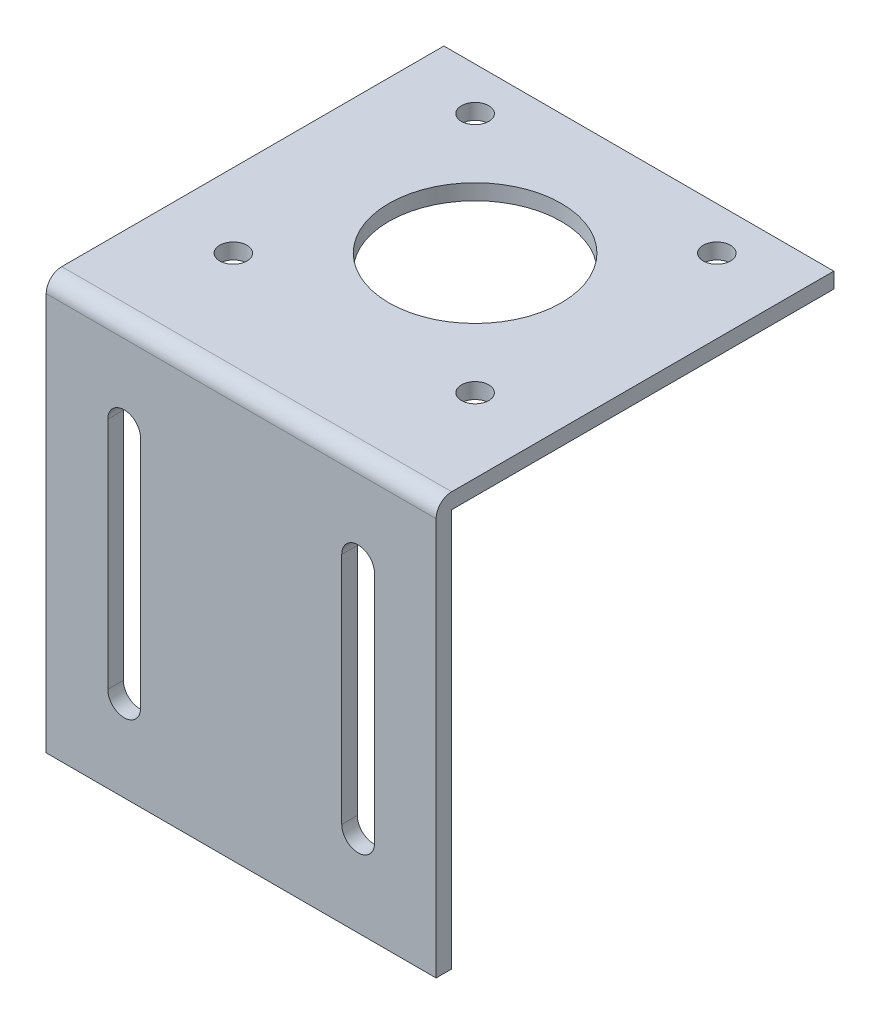
ISO-10303-21;
HEADER;
FILE_DESCRIPTION(('STEP AP214'),'2;1');
FILE_NAME('part.step','',(''),(''),'','','');
FILE_SCHEMA(('AUTOMOTIVE_DESIGN { 1 0 10303 214 1 1 1 1 }'));
ENDSEC;
DATA;
#1=APPLICATION_CONTEXT('core data for automotive mechanical design processes');
#2=APPLICATION_PROTOCOL_DEFINITION('international standard','automotive_design',2000,#1);
#3=PRODUCT_CONTEXT('',#1,'mechanical');
#4=PRODUCT('Part','Part','',(#3));
#5=PRODUCT_RELATED_PRODUCT_CATEGORY('part','',(#4));
#6=PRODUCT_DEFINITION_FORMATION('','',#4);
#7=PRODUCT_DEFINITION_CONTEXT('part definition',#1,'design');
#8=PRODUCT_DEFINITION('design','',#6,#7);
#9=PRODUCT_DEFINITION_SHAPE('','',#8);
#10=(LENGTH_UNIT() NAMED_UNIT(*) SI_UNIT(.MILLI.,.METRE.));
#11=(NAMED_UNIT(*) PLANE_ANGLE_UNIT() SI_UNIT($,.RADIAN.));
#12=(NAMED_UNIT(*) SI_UNIT($,.STERADIAN.) SOLID_ANGLE_UNIT());
#13=UNCERTAINTY_MEASURE_WITH_UNIT(LENGTH_MEASURE(1.E-05),#10,'distance_accuracy_value','');
#14=(GEOMETRIC_REPRESENTATION_CONTEXT(3) GLOBAL_UNCERTAINTY_ASSIGNED_CONTEXT((#13)) GLOBAL_UNIT_ASSIGNED_CONTEXT((#10,
#11,#12)) REPRESENTATION_CONTEXT('',''));
#15=CARTESIAN_POINT('',(0.,0.,0.));
#16=DIRECTION('',(0.,0.,1.));
#17=DIRECTION('',(1.,0.,0.));
#18=AXIS2_PLACEMENT_3D('',#15,#16,#17);
#19=CARTESIAN_POINT('',(0.,2.,0.));
#20=DIRECTION('',(0.,1.,0.));
#21=DIRECTION('',(0.,0.,1.));
#22=AXIS2_PLACEMENT_3D('',#19,#20,#21);
#23=PLANE('',#22);
#24=CARTESIAN_POINT('',(-9.5,2.,12.));
#25=DIRECTION('',(0.,1.,0.));
#26=DIRECTION('',(0.,0.,1.));
#27=AXIS2_PLACEMENT_3D('',#24,#25,#26);
#28=CIRCLE('',#27,1.75);
#29=CARTESIAN_POINT('',(-9.5,2.,13.75));
#30=VERTEX_POINT('',#29);
#31=EDGE_CURVE('E243',#30,#30,#28,.T.);
#32=ORIENTED_EDGE('',*,*,#31,.F.);
#33=EDGE_LOOP('',(#32));
#34=FACE_BOUND('',#33,.T.);
#35=CARTESIAN_POINT('',(-40.5,2.,-19.));
#36=DIRECTION('',(0.,1.,0.));
#37=DIRECTION('',(0.,0.,1.));
#38=AXIS2_PLACEMENT_3D('',#35,#36,#37);
#39=CIRCLE('',#38,1.75);
#40=CARTESIAN_POINT('',(-40.5,2.,-17.25));
#41=VERTEX_POINT('',#40);
#42=EDGE_CURVE('E255',#41,#41,#39,.T.);
#43=ORIENTED_EDGE('',*,*,#42,.F.);
#44=EDGE_LOOP('',(#43));
#45=FACE_BOUND('',#44,.T.);
#46=DIRECTION('',(0.,0.,1.));
#47=VECTOR('',#46,1.);
#48=CARTESIAN_POINT('',(-50.,2.,-24.5));
#49=LINE('',#48,#47);
#50=CARTESIAN_POINT('',(-50.,2.,-24.5));
#51=VERTEX_POINT('',#50);
#52=CARTESIAN_POINT('',(-50.,2.,24.5));
#53=VERTEX_POINT('',#52);
#54=EDGE_CURVE('E267',#51,#53,#49,.T.);
#55=ORIENTED_EDGE('',*,*,#54,.T.);
#56=DIRECTION('',(-1.,0.,0.));
#57=VECTOR('',#56,1.);
#58=CARTESIAN_POINT('',(0.,2.,24.5));
#59=LINE('',#58,#57);
#60=CARTESIAN_POINT('',(0.,2.,24.5));
#61=VERTEX_POINT('',#60);
#62=EDGE_CURVE('E44',#53,#61,#59,.F.);
#63=ORIENTED_EDGE('',*,*,#62,.T.);
#64=DIRECTION('',(0.,0.,-1.));
#65=VECTOR('',#64,1.);
#66=CARTESIAN_POINT('',(0.,2.,-24.5));
#67=LINE('',#66,#65);
#68=CARTESIAN_POINT('',(0.,2.,-24.5));
#69=VERTEX_POINT('',#68);
#70=EDGE_CURVE('E269',#61,#69,#67,.T.);
#71=ORIENTED_EDGE('',*,*,#70,.T.);
#72=DIRECTION('',(-1.,0.,0.));
#73=VECTOR('',#72,1.);
#74=CARTESIAN_POINT('',(-50.,2.,-24.5));
#75=LINE('',#74,#73);
#76=EDGE_CURVE('E272',#69,#51,#75,.T.);
#77=ORIENTED_EDGE('',*,*,#76,.T.);
#78=EDGE_LOOP('',(#55,#63,#71,#77));
#79=FACE_BOUND('',#78,.T.);
#80=CARTESIAN_POINT('',(-25.,2.,-3.5));
#81=DIRECTION('',(0.,1.,0.));
#82=DIRECTION('',(0.,0.,1.));
#83=AXIS2_PLACEMENT_3D('',#80,#81,#82);
#84=CIRCLE('',#83,11.05);
#85=CARTESIAN_POINT('',(-25.,2.,7.55));
#86=VERTEX_POINT('',#85);
#87=EDGE_CURVE('E261',#86,#86,#84,.T.);
#88=ORIENTED_EDGE('',*,*,#87,.F.);
#89=EDGE_LOOP('',(#88));
#90=FACE_BOUND('',#89,.T.);
#91=CARTESIAN_POINT('',(-9.5,2.,-19.));
#92=DIRECTION('',(0.,1.,0.));
#93=DIRECTION('',(0.,0.,1.));
#94=AXIS2_PLACEMENT_3D('',#91,#92,#93);
#95=CIRCLE('',#94,1.75);
#96=CARTESIAN_POINT('',(-9.5,2.,-17.25));
#97=VERTEX_POINT('',#96);
#98=EDGE_CURVE('E249',#97,#97,#95,.T.);
#99=ORIENTED_EDGE('',*,*,#98,.F.);
#100=EDGE_LOOP('',(#99));
#101=FACE_BOUND('',#100,.T.);
#102=CARTESIAN_POINT('',(-40.5,2.,12.));
#103=DIRECTION('',(0.,1.,0.));
#104=DIRECTION('',(0.,0.,1.));
#105=AXIS2_PLACEMENT_3D('',#102,#103,#104);
#106=CIRCLE('',#105,1.75);
#107=CARTESIAN_POINT('',(-40.5,2.,13.75));
#108=VERTEX_POINT('',#107);
#109=EDGE_CURVE('E237',#108,#108,#106,.T.);
#110=ORIENTED_EDGE('',*,*,#109,.F.);
#111=EDGE_LOOP('',(#110));
#112=FACE_BOUND('',#111,.T.);
#113=ADVANCED_FACE('F36',(#34,#45,#79,#90,#101,#112),#23,.T.);
#114=CARTESIAN_POINT('',(0.,0.,0.));
#115=DIRECTION('',(0.,1.,0.));
#116=DIRECTION('',(0.,0.,1.));
#117=AXIS2_PLACEMENT_3D('',#114,#115,#116);
#118=PLANE('',#117);
#119=DIRECTION('',(0.,0.,1.));
#120=VECTOR('',#119,1.);
#121=CARTESIAN_POINT('',(-50.,0.,-24.5));
#122=LINE('',#121,#120);
#123=CARTESIAN_POINT('',(-50.,0.,-24.5));
#124=VERTEX_POINT('',#123);
#125=CARTESIAN_POINT('',(-50.,0.,24.5));
#126=VERTEX_POINT('',#125);
#127=EDGE_CURVE('E264',#124,#126,#122,.T.);
#128=ORIENTED_EDGE('',*,*,#127,.F.);
#129=DIRECTION('',(-1.,0.,0.));
#130=VECTOR('',#129,1.);
#131=CARTESIAN_POINT('',(-50.,0.,-24.5));
#132=LINE('',#131,#130);
#133=CARTESIAN_POINT('',(0.,0.,-24.5));
#134=VERTEX_POINT('',#133);
#135=EDGE_CURVE('E270',#134,#124,#132,.T.);
#136=ORIENTED_EDGE('',*,*,#135,.F.);
#137=DIRECTION('',(0.,0.,-1.));
#138=VECTOR('',#137,1.);
#139=CARTESIAN_POINT('',(0.,0.,-24.5));
#140=LINE('',#139,#138);
#141=CARTESIAN_POINT('',(0.,0.,24.5));
#142=VERTEX_POINT('',#141);
#143=EDGE_CURVE('E280',#142,#134,#140,.T.);
#144=ORIENTED_EDGE('',*,*,#143,.F.);
#145=DIRECTION('',(1.,0.,0.));
#146=VECTOR('',#145,1.);
#147=CARTESIAN_POINT('',(-50.,0.,24.5));
#148=LINE('',#147,#146);
#149=EDGE_CURVE('E277',#126,#142,#148,.T.);
#150=ORIENTED_EDGE('',*,*,#149,.F.);
#151=EDGE_LOOP('',(#128,#136,#144,#150));
#152=FACE_BOUND('',#151,.T.);
#153=CARTESIAN_POINT('',(-25.,0.,-3.5));
#154=DIRECTION('',(0.,1.,0.));
#155=DIRECTION('',(0.,0.,1.));
#156=AXIS2_PLACEMENT_3D('',#153,#154,#155);
#157=CIRCLE('',#156,11.05);
#158=CARTESIAN_POINT('',(-25.,0.,7.55));
#159=VERTEX_POINT('',#158);
#160=EDGE_CURVE('E258',#159,#159,#157,.T.);
#161=ORIENTED_EDGE('',*,*,#160,.T.);
#162=EDGE_LOOP('',(#161));
#163=FACE_BOUND('',#162,.T.);
#164=CARTESIAN_POINT('',(-40.5,0.,-19.));
#165=DIRECTION('',(0.,1.,0.));
#166=DIRECTION('',(0.,0.,1.));
#167=AXIS2_PLACEMENT_3D('',#164,#165,#166);
#168=CIRCLE('',#167,1.75);
#169=CARTESIAN_POINT('',(-40.5,0.,-17.25));
#170=VERTEX_POINT('',#169);
#171=EDGE_CURVE('E252',#170,#170,#168,.T.);
#172=ORIENTED_EDGE('',*,*,#171,.T.);
#173=EDGE_LOOP('',(#172));
#174=FACE_BOUND('',#173,.T.);
#175=CARTESIAN_POINT('',(-9.5,0.,-19.));
#176=DIRECTION('',(0.,1.,0.));
#177=DIRECTION('',(0.,0.,1.));
#178=AXIS2_PLACEMENT_3D('',#175,#176,#177);
#179=CIRCLE('',#178,1.75);
#180=CARTESIAN_POINT('',(-9.5,0.,-17.25));
#181=VERTEX_POINT('',#180);
#182=EDGE_CURVE('E246',#181,#181,#179,.T.);
#183=ORIENTED_EDGE('',*,*,#182,.T.);
#184=EDGE_LOOP('',(#183));
#185=FACE_BOUND('',#184,.T.);
#186=CARTESIAN_POINT('',(-9.5,0.,12.));
#187=DIRECTION('',(0.,1.,0.));
#188=DIRECTION('',(0.,0.,1.));
#189=AXIS2_PLACEMENT_3D('',#186,#187,#188);
#190=CIRCLE('',#189,1.75);
#191=CARTESIAN_POINT('',(-9.5,0.,13.75));
#192=VERTEX_POINT('',#191);
#193=EDGE_CURVE('E240',#192,#192,#190,.T.);
#194=ORIENTED_EDGE('',*,*,#193,.T.);
#195=EDGE_LOOP('',(#194));
#196=FACE_BOUND('',#195,.T.);
#197=CARTESIAN_POINT('',(-40.5,0.,12.));
#198=DIRECTION('',(0.,1.,0.));
#199=DIRECTION('',(0.,0.,1.));
#200=AXIS2_PLACEMENT_3D('',#197,#198,#199);
#201=CIRCLE('',#200,1.75);
#202=CARTESIAN_POINT('',(-40.5,0.,13.75));
#203=VERTEX_POINT('',#202);
#204=EDGE_CURVE('E236',#203,#203,#201,.T.);
#205=ORIENTED_EDGE('',*,*,#204,.T.);
#206=EDGE_LOOP('',(#205));
#207=FACE_BOUND('',#206,.T.);
#208=ADVANCED_FACE('F311',(#152,#163,#174,#185,#196,#207),#118,.F.);
#209=CARTESIAN_POINT('',(-50.,2.,-24.5));
#210=DIRECTION('',(1.,0.,0.));
#211=DIRECTION('',(0.,0.,-1.));
#212=AXIS2_PLACEMENT_3D('',#209,#210,#211);
#213=PLANE('',#212);
#214=DIRECTION('',(0.,-1.,0.));
#215=VECTOR('',#214,1.);
#216=CARTESIAN_POINT('',(-50.,0.,26.5));
#217=LINE('',#216,#215);
#218=CARTESIAN_POINT('',(-50.,0.,26.5));
#219=VERTEX_POINT('',#218);
#220=CARTESIAN_POINT('',(-50.,-51.,26.5));
#221=VERTEX_POINT('',#220);
#222=EDGE_CURVE('E219',#219,#221,#217,.T.);
#223=ORIENTED_EDGE('',*,*,#222,.F.);
#224=CARTESIAN_POINT('',(-50.,0.,24.5));
#225=DIRECTION('',(1.,0.,0.));
#226=DIRECTION('',(0.,0.,-1.));
#227=AXIS2_PLACEMENT_3D('',#224,#225,#226);
#228=CIRCLE('',#227,2.);
#229=EDGE_CURVE('E58',#219,#53,#228,.F.);
#230=ORIENTED_EDGE('',*,*,#229,.T.);
#231=ORIENTED_EDGE('',*,*,#54,.F.);
#232=DIRECTION('',(0.,-1.,0.));
#233=VECTOR('',#232,1.);
#234=CARTESIAN_POINT('',(-50.,2.,-24.5));
#235=LINE('',#234,#233);
#236=EDGE_CURVE('E274',#51,#124,#235,.T.);
#237=ORIENTED_EDGE('',*,*,#236,.T.);
#238=ORIENTED_EDGE('',*,*,#127,.T.);
#239=DIRECTION('',(0.,-1.,0.));
#240=VECTOR('',#239,1.);
#241=CARTESIAN_POINT('',(-50.,0.,24.5));
#242=LINE('',#241,#240);
#243=CARTESIAN_POINT('',(-50.,-51.,24.5));
#244=VERTEX_POINT('',#243);
#245=EDGE_CURVE('E215',#126,#244,#242,.T.);
#246=ORIENTED_EDGE('',*,*,#245,.T.);
#247=DIRECTION('',(0.,0.,-1.));
#248=VECTOR('',#247,1.);
#249=CARTESIAN_POINT('',(-50.,-51.,26.5));
#250=LINE('',#249,#248);
#251=EDGE_CURVE('E233',#221,#244,#250,.T.);
#252=ORIENTED_EDGE('',*,*,#251,.F.);
#253=EDGE_LOOP('',(#223,#230,#231,#237,#238,#246,#252));
#254=FACE_BOUND('',#253,.T.);
#255=ADVANCED_FACE('F297',(#254),#213,.F.);
#256=CARTESIAN_POINT('',(0.,2.,-24.5));
#257=DIRECTION('',(-1.,0.,0.));
#258=DIRECTION('',(0.,0.,1.));
#259=AXIS2_PLACEMENT_3D('',#256,#257,#258);
#260=PLANE('',#259);
#261=ORIENTED_EDGE('',*,*,#70,.F.);
#262=CARTESIAN_POINT('',(0.,0.,24.5));
#263=DIRECTION('',(-1.,0.,0.));
#264=DIRECTION('',(0.,0.,1.));
#265=AXIS2_PLACEMENT_3D('',#262,#263,#264);
#266=CIRCLE('',#265,2.);
#267=CARTESIAN_POINT('',(0.,0.,26.5));
#268=VERTEX_POINT('',#267);
#269=EDGE_CURVE('E11',#61,#268,#266,.F.);
#270=ORIENTED_EDGE('',*,*,#269,.T.);
#271=DIRECTION('',(0.,1.,0.));
#272=VECTOR('',#271,1.);
#273=CARTESIAN_POINT('',(0.,0.,26.5));
#274=LINE('',#273,#272);
#275=CARTESIAN_POINT('',(0.,-51.,26.5));
#276=VERTEX_POINT('',#275);
#277=EDGE_CURVE('E216',#276,#268,#274,.T.);
#278=ORIENTED_EDGE('',*,*,#277,.F.);
#279=DIRECTION('',(0.,0.,-1.));
#280=VECTOR('',#279,1.);
#281=CARTESIAN_POINT('',(0.,-51.,26.5));
#282=LINE('',#281,#280);
#283=CARTESIAN_POINT('',(0.,-51.,24.5));
#284=VERTEX_POINT('',#283);
#285=EDGE_CURVE('E225',#276,#284,#282,.T.);
#286=ORIENTED_EDGE('',*,*,#285,.T.);
#287=DIRECTION('',(0.,1.,0.));
#288=VECTOR('',#287,1.);
#289=CARTESIAN_POINT('',(0.,0.,24.5));
#290=LINE('',#289,#288);
#291=EDGE_CURVE('E220',#284,#142,#290,.T.);
#292=ORIENTED_EDGE('',*,*,#291,.T.);
#293=ORIENTED_EDGE('',*,*,#143,.T.);
#294=DIRECTION('',(0.,-1.,0.));
#295=VECTOR('',#294,1.);
#296=CARTESIAN_POINT('',(0.,2.,-24.5));
#297=LINE('',#296,#295);
#298=EDGE_CURVE('E285',#69,#134,#297,.T.);
#299=ORIENTED_EDGE('',*,*,#298,.F.);
#300=EDGE_LOOP('',(#261,#270,#278,#286,#292,#293,#299));
#301=FACE_BOUND('',#300,.T.);
#302=ADVANCED_FACE('F306',(#301),#260,.F.);
#303=CARTESIAN_POINT('',(-50.,2.,-24.5));
#304=DIRECTION('',(0.,0.,1.));
#305=DIRECTION('',(1.,0.,0.));
#306=AXIS2_PLACEMENT_3D('',#303,#304,#305);
#307=PLANE('',#306);
#308=ORIENTED_EDGE('',*,*,#135,.T.);
#309=ORIENTED_EDGE('',*,*,#236,.F.);
#310=ORIENTED_EDGE('',*,*,#76,.F.);
#311=ORIENTED_EDGE('',*,*,#298,.T.);
#312=EDGE_LOOP('',(#308,#309,#310,#311));
#313=FACE_BOUND('',#312,.T.);
#314=ADVANCED_FACE('F317',(#313),#307,.F.);
#315=CARTESIAN_POINT('',(-25.,2.,-3.5));
#316=DIRECTION('',(0.,-1.,0.));
#317=DIRECTION('',(0.,0.,-1.));
#318=AXIS2_PLACEMENT_3D('',#315,#316,#317);
#319=CYLINDRICAL_SURFACE('',#318,11.05);
#320=ORIENTED_EDGE('',*,*,#87,.T.);
#321=EDGE_LOOP('',(#320));
#322=FACE_BOUND('',#321,.T.);
#323=ORIENTED_EDGE('',*,*,#160,.F.);
#324=EDGE_LOOP('',(#323));
#325=FACE_BOUND('',#324,.T.);
#326=ADVANCED_FACE('F337',(#322,#325),#319,.F.);
#327=CARTESIAN_POINT('',(-40.5,2.,-19.));
#328=DIRECTION('',(0.,-1.,0.));
#329=DIRECTION('',(0.,0.,-1.));
#330=AXIS2_PLACEMENT_3D('',#327,#328,#329);
#331=CYLINDRICAL_SURFACE('',#330,1.75);
#332=ORIENTED_EDGE('',*,*,#42,.T.);
#333=EDGE_LOOP('',(#332));
#334=FACE_BOUND('',#333,.T.);
#335=ORIENTED_EDGE('',*,*,#171,.F.);
#336=EDGE_LOOP('',(#335));
#337=FACE_BOUND('',#336,.T.);
#338=ADVANCED_FACE('F363',(#334,#337),#331,.F.);
#339=CARTESIAN_POINT('',(-9.5,2.,-19.));
#340=DIRECTION('',(0.,-1.,0.));
#341=DIRECTION('',(0.,0.,-1.));
#342=AXIS2_PLACEMENT_3D('',#339,#340,#341);
#343=CYLINDRICAL_SURFACE('',#342,1.75);
#344=ORIENTED_EDGE('',*,*,#98,.T.);
#345=EDGE_LOOP('',(#344));
#346=FACE_BOUND('',#345,.T.);
#347=ORIENTED_EDGE('',*,*,#182,.F.);
#348=EDGE_LOOP('',(#347));
#349=FACE_BOUND('',#348,.T.);
#350=ADVANCED_FACE('F370',(#346,#349),#343,.F.);
#351=CARTESIAN_POINT('',(-9.5,2.,12.));
#352=DIRECTION('',(0.,-1.,0.));
#353=DIRECTION('',(0.,0.,-1.));
#354=AXIS2_PLACEMENT_3D('',#351,#352,#353);
#355=CYLINDRICAL_SURFACE('',#354,1.75);
#356=ORIENTED_EDGE('',*,*,#31,.T.);
#357=EDGE_LOOP('',(#356));
#358=FACE_BOUND('',#357,.T.);
#359=ORIENTED_EDGE('',*,*,#193,.F.);
#360=EDGE_LOOP('',(#359));
#361=FACE_BOUND('',#360,.T.);
#362=ADVANCED_FACE('F377',(#358,#361),#355,.F.);
#363=CARTESIAN_POINT('',(-40.5,2.,12.));
#364=DIRECTION('',(0.,-1.,0.));
#365=DIRECTION('',(0.,0.,-1.));
#366=AXIS2_PLACEMENT_3D('',#363,#364,#365);
#367=CYLINDRICAL_SURFACE('',#366,1.75);
#368=ORIENTED_EDGE('',*,*,#109,.T.);
#369=EDGE_LOOP('',(#368));
#370=FACE_BOUND('',#369,.T.);
#371=ORIENTED_EDGE('',*,*,#204,.F.);
#372=EDGE_LOOP('',(#371));
#373=FACE_BOUND('',#372,.T.);
#374=ADVANCED_FACE('F385',(#370,#373),#367,.F.);
#375=CARTESIAN_POINT('',(0.,0.,24.5));
#376=DIRECTION('',(0.,0.,1.));
#377=DIRECTION('',(1.,0.,0.));
#378=AXIS2_PLACEMENT_3D('',#375,#376,#377);
#379=PLANE('',#378);
#380=CARTESIAN_POINT('',(-10.,-9.99999999999999,24.5));
#381=DIRECTION('',(0.,0.,1.));
#382=DIRECTION('',(-1.,0.,0.));
#383=AXIS2_PLACEMENT_3D('',#380,#381,#382);
#384=CIRCLE('',#383,2.1);
#385=CARTESIAN_POINT('',(-7.90000000000001,-9.99999999999999,24.5));
#386=VERTEX_POINT('',#385);
#387=CARTESIAN_POINT('',(-12.1,-9.99999999999999,24.5));
#388=VERTEX_POINT('',#387);
#389=EDGE_CURVE('E161',#386,#388,#384,.T.);
#390=ORIENTED_EDGE('',*,*,#389,.T.);
#391=DIRECTION('',(0.,-1.,0.));
#392=VECTOR('',#391,1.);
#393=CARTESIAN_POINT('',(-12.1,-9.99999999999999,24.5));
#394=LINE('',#393,#392);
#395=CARTESIAN_POINT('',(-12.1,-40.,24.5));
#396=VERTEX_POINT('',#395);
#397=EDGE_CURVE('E198',#388,#396,#394,.T.);
#398=ORIENTED_EDGE('',*,*,#397,.T.);
#399=CARTESIAN_POINT('',(-10.,-40.,24.5));
#400=DIRECTION('',(0.,0.,1.));
#401=DIRECTION('',(-1.,0.,0.));
#402=AXIS2_PLACEMENT_3D('',#399,#400,#401);
#403=CIRCLE('',#402,2.1);
#404=CARTESIAN_POINT('',(-7.90000000000001,-40.,24.5));
#405=VERTEX_POINT('',#404);
#406=EDGE_CURVE('E201',#396,#405,#403,.T.);
#407=ORIENTED_EDGE('',*,*,#406,.T.);
#408=DIRECTION('',(0.,1.,0.));
#409=VECTOR('',#408,1.);
#410=CARTESIAN_POINT('',(-7.90000000000001,-9.99999999999999,24.5));
#411=LINE('',#410,#409);
#412=EDGE_CURVE('E188',#405,#386,#411,.T.);
#413=ORIENTED_EDGE('',*,*,#412,.T.);
#414=EDGE_LOOP('',(#390,#398,#407,#413));
#415=FACE_BOUND('',#414,.T.);
#416=CARTESIAN_POINT('',(-40.,-9.99999999999999,24.5));
#417=DIRECTION('',(0.,0.,1.));
#418=DIRECTION('',(-1.,0.,0.));
#419=AXIS2_PLACEMENT_3D('',#416,#417,#418);
#420=CIRCLE('',#419,2.1);
#421=CARTESIAN_POINT('',(-37.9,-9.99999999999999,24.5));
#422=VERTEX_POINT('',#421);
#423=CARTESIAN_POINT('',(-42.1,-9.99999999999999,24.5));
#424=VERTEX_POINT('',#423);
#425=EDGE_CURVE('E173',#422,#424,#420,.T.);
#426=ORIENTED_EDGE('',*,*,#425,.T.);
#427=DIRECTION('',(0.,-1.,0.));
#428=VECTOR('',#427,1.);
#429=CARTESIAN_POINT('',(-42.1,-9.99999999999999,24.5));
#430=LINE('',#429,#428);
#431=CARTESIAN_POINT('',(-42.1,-40.,24.5));
#432=VERTEX_POINT('',#431);
#433=EDGE_CURVE('E160',#424,#432,#430,.T.);
#434=ORIENTED_EDGE('',*,*,#433,.T.);
#435=CARTESIAN_POINT('',(-40.,-40.,24.5));
#436=DIRECTION('',(0.,0.,1.));
#437=DIRECTION('',(-1.,0.,0.));
#438=AXIS2_PLACEMENT_3D('',#435,#436,#437);
#439=CIRCLE('',#438,2.1);
#440=CARTESIAN_POINT('',(-37.9,-40.,24.5));
#441=VERTEX_POINT('',#440);
#442=EDGE_CURVE('E176',#432,#441,#439,.T.);
#443=ORIENTED_EDGE('',*,*,#442,.T.);
#444=DIRECTION('',(0.,1.,0.));
#445=VECTOR('',#444,1.);
#446=CARTESIAN_POINT('',(-37.9,-9.99999999999999,24.5));
#447=LINE('',#446,#445);
#448=EDGE_CURVE('E154',#441,#422,#447,.T.);
#449=ORIENTED_EDGE('',*,*,#448,.T.);
#450=EDGE_LOOP('',(#426,#434,#443,#449));
#451=FACE_BOUND('',#450,.T.);
#452=ORIENTED_EDGE('',*,*,#245,.F.);
#453=ORIENTED_EDGE('',*,*,#149,.T.);
#454=ORIENTED_EDGE('',*,*,#291,.F.);
#455=DIRECTION('',(1.,0.,0.));
#456=VECTOR('',#455,1.);
#457=CARTESIAN_POINT('',(0.,-51.,24.5));
#458=LINE('',#457,#456);
#459=EDGE_CURVE('E227',#244,#284,#458,.T.);
#460=ORIENTED_EDGE('',*,*,#459,.F.);
#461=EDGE_LOOP('',(#452,#453,#454,#460));
#462=FACE_BOUND('',#461,.T.);
#463=ADVANCED_FACE('F308',(#415,#451,#462),#379,.F.);
#464=CARTESIAN_POINT('',(0.,0.,26.5));
#465=DIRECTION('',(0.,0.,1.));
#466=DIRECTION('',(1.,0.,0.));
#467=AXIS2_PLACEMENT_3D('',#464,#465,#466);
#468=PLANE('',#467);
#469=ORIENTED_EDGE('',*,*,#277,.T.);
#470=DIRECTION('',(-1.,0.,0.));
#471=VECTOR('',#470,1.);
#472=CARTESIAN_POINT('',(0.,0.,26.5));
#473=LINE('',#472,#471);
#474=EDGE_CURVE('E288',#268,#219,#473,.T.);
#475=ORIENTED_EDGE('',*,*,#474,.T.);
#476=ORIENTED_EDGE('',*,*,#222,.T.);
#477=DIRECTION('',(1.,0.,0.));
#478=VECTOR('',#477,1.);
#479=CARTESIAN_POINT('',(0.,-51.,26.5));
#480=LINE('',#479,#478);
#481=EDGE_CURVE('E222',#221,#276,#480,.T.);
#482=ORIENTED_EDGE('',*,*,#481,.T.);
#483=EDGE_LOOP('',(#469,#475,#476,#482));
#484=FACE_BOUND('',#483,.T.);
#485=DIRECTION('',(0.,-1.,0.));
#486=VECTOR('',#485,1.);
#487=CARTESIAN_POINT('',(-12.1,-9.99999999999999,26.5));
#488=LINE('',#487,#486);
#489=CARTESIAN_POINT('',(-12.1,-9.99999999999999,26.5));
#490=VERTEX_POINT('',#489);
#491=CARTESIAN_POINT('',(-12.1,-40.,26.5));
#492=VERTEX_POINT('',#491);
#493=EDGE_CURVE('E187',#490,#492,#488,.T.);
#494=ORIENTED_EDGE('',*,*,#493,.F.);
#495=CARTESIAN_POINT('',(-10.,-9.99999999999999,26.5));
#496=DIRECTION('',(0.,0.,1.));
#497=DIRECTION('',(-1.,0.,0.));
#498=AXIS2_PLACEMENT_3D('',#495,#496,#497);
#499=CIRCLE('',#498,2.1);
#500=CARTESIAN_POINT('',(-7.90000000000001,-9.99999999999999,26.5));
#501=VERTEX_POINT('',#500);
#502=EDGE_CURVE('E185',#501,#490,#499,.T.);
#503=ORIENTED_EDGE('',*,*,#502,.F.);
#504=DIRECTION('',(0.,1.,0.));
#505=VECTOR('',#504,1.);
#506=CARTESIAN_POINT('',(-7.90000000000001,-9.99999999999999,26.5));
#507=LINE('',#506,#505);
#508=CARTESIAN_POINT('',(-7.90000000000001,-40.,26.5));
#509=VERTEX_POINT('',#508);
#510=EDGE_CURVE('E193',#509,#501,#507,.T.);
#511=ORIENTED_EDGE('',*,*,#510,.F.);
#512=CARTESIAN_POINT('',(-10.,-40.,26.5));
#513=DIRECTION('',(0.,0.,1.));
#514=DIRECTION('',(-1.,0.,0.));
#515=AXIS2_PLACEMENT_3D('',#512,#513,#514);
#516=CIRCLE('',#515,2.1);
#517=EDGE_CURVE('E190',#492,#509,#516,.T.);
#518=ORIENTED_EDGE('',*,*,#517,.F.);
#519=EDGE_LOOP('',(#494,#503,#511,#518));
#520=FACE_BOUND('',#519,.T.);
#521=DIRECTION('',(0.,-1.,0.));
#522=VECTOR('',#521,1.);
#523=CARTESIAN_POINT('',(-42.1,-9.99999999999999,26.5));
#524=LINE('',#523,#522);
#525=CARTESIAN_POINT('',(-42.1,-9.99999999999999,26.5));
#526=VERTEX_POINT('',#525);
#527=CARTESIAN_POINT('',(-42.1,-40.,26.5));
#528=VERTEX_POINT('',#527);
#529=EDGE_CURVE('E153',#526,#528,#524,.T.);
#530=ORIENTED_EDGE('',*,*,#529,.F.);
#531=CARTESIAN_POINT('',(-40.,-9.99999999999999,26.5));
#532=DIRECTION('',(0.,0.,1.));
#533=DIRECTION('',(-1.,0.,0.));
#534=AXIS2_PLACEMENT_3D('',#531,#532,#533);
#535=CIRCLE('',#534,2.1);
#536=CARTESIAN_POINT('',(-37.9,-9.99999999999999,26.5));
#537=VERTEX_POINT('',#536);
#538=EDGE_CURVE('E143',#537,#526,#535,.T.);
#539=ORIENTED_EDGE('',*,*,#538,.F.);
#540=DIRECTION('',(0.,1.,0.));
#541=VECTOR('',#540,1.);
#542=CARTESIAN_POINT('',(-37.9,-9.99999999999999,26.5));
#543=LINE('',#542,#541);
#544=CARTESIAN_POINT('',(-37.9,-40.,26.5));
#545=VERTEX_POINT('',#544);
#546=EDGE_CURVE('E169',#545,#537,#543,.T.);
#547=ORIENTED_EDGE('',*,*,#546,.F.);
#548=CARTESIAN_POINT('',(-40.,-40.,26.5));
#549=DIRECTION('',(0.,0.,1.));
#550=DIRECTION('',(-1.,0.,0.));
#551=AXIS2_PLACEMENT_3D('',#548,#549,#550);
#552=CIRCLE('',#551,2.1);
#553=EDGE_CURVE('E167',#528,#545,#552,.T.);
#554=ORIENTED_EDGE('',*,*,#553,.F.);
#555=EDGE_LOOP('',(#530,#539,#547,#554));
#556=FACE_BOUND('',#555,.T.);
#557=ADVANCED_FACE('F165',(#484,#520,#556),#468,.T.);
#558=CARTESIAN_POINT('',(0.,-51.,26.5));
#559=DIRECTION('',(0.,1.,0.));
#560=DIRECTION('',(-1.,0.,0.));
#561=AXIS2_PLACEMENT_3D('',#558,#559,#560);
#562=PLANE('',#561);
#563=ORIENTED_EDGE('',*,*,#459,.T.);
#564=ORIENTED_EDGE('',*,*,#285,.F.);
#565=ORIENTED_EDGE('',*,*,#481,.F.);
#566=ORIENTED_EDGE('',*,*,#251,.T.);
#567=EDGE_LOOP('',(#563,#564,#565,#566));
#568=FACE_BOUND('',#567,.T.);
#569=ADVANCED_FACE('F303',(#568),#562,.F.);
#570=CARTESIAN_POINT('',(-10.,-9.99999999999999,26.5));
#571=DIRECTION('',(0.,0.,-1.));
#572=DIRECTION('',(-1.,0.,0.));
#573=AXIS2_PLACEMENT_3D('',#570,#571,#572);
#574=CYLINDRICAL_SURFACE('',#573,2.1);
#575=ORIENTED_EDGE('',*,*,#389,.F.);
#576=DIRECTION('',(0.,0.,-1.));
#577=VECTOR('',#576,1.);
#578=CARTESIAN_POINT('',(-7.90000000000001,-9.99999999999999,26.5));
#579=LINE('',#578,#577);
#580=EDGE_CURVE('E195',#501,#386,#579,.T.);
#581=ORIENTED_EDGE('',*,*,#580,.F.);
#582=ORIENTED_EDGE('',*,*,#502,.T.);
#583=DIRECTION('',(0.,0.,-1.));
#584=VECTOR('',#583,1.);
#585=CARTESIAN_POINT('',(-12.1,-9.99999999999999,26.5));
#586=LINE('',#585,#584);
#587=EDGE_CURVE('E212',#490,#388,#586,.T.);
#588=ORIENTED_EDGE('',*,*,#587,.T.);
#589=EDGE_LOOP('',(#575,#581,#582,#588));
#590=FACE_BOUND('',#589,.T.);
#591=ADVANCED_FACE('F412',(#590),#574,.F.);
#592=CARTESIAN_POINT('',(-12.1,-9.99999999999999,26.5));
#593=DIRECTION('',(1.,0.,0.));
#594=DIRECTION('',(0.,0.,-1.));
#595=AXIS2_PLACEMENT_3D('',#592,#593,#594);
#596=PLANE('',#595);
#597=ORIENTED_EDGE('',*,*,#397,.F.);
#598=ORIENTED_EDGE('',*,*,#587,.F.);
#599=ORIENTED_EDGE('',*,*,#493,.T.);
#600=DIRECTION('',(0.,0.,-1.));
#601=VECTOR('',#600,1.);
#602=CARTESIAN_POINT('',(-12.1,-40.,26.5));
#603=LINE('',#602,#601);
#604=EDGE_CURVE('E210',#492,#396,#603,.T.);
#605=ORIENTED_EDGE('',*,*,#604,.T.);
#606=EDGE_LOOP('',(#597,#598,#599,#605));
#607=FACE_BOUND('',#606,.T.);
#608=ADVANCED_FACE('F419',(#607),#596,.T.);
#609=CARTESIAN_POINT('',(-10.,-40.,26.5));
#610=DIRECTION('',(0.,0.,-1.));
#611=DIRECTION('',(-1.,0.,0.));
#612=AXIS2_PLACEMENT_3D('',#609,#610,#611);
#613=CYLINDRICAL_SURFACE('',#612,2.1);
#614=ORIENTED_EDGE('',*,*,#406,.F.);
#615=ORIENTED_EDGE('',*,*,#604,.F.);
#616=ORIENTED_EDGE('',*,*,#517,.T.);
#617=DIRECTION('',(0.,0.,-1.));
#618=VECTOR('',#617,1.);
#619=CARTESIAN_POINT('',(-7.90000000000001,-40.,26.5));
#620=LINE('',#619,#618);
#621=EDGE_CURVE('E208',#509,#405,#620,.T.);
#622=ORIENTED_EDGE('',*,*,#621,.T.);
#623=EDGE_LOOP('',(#614,#615,#616,#622));
#624=FACE_BOUND('',#623,.T.);
#625=ADVANCED_FACE('F427',(#624),#613,.F.);
#626=CARTESIAN_POINT('',(-7.90000000000001,-9.99999999999999,26.5));
#627=DIRECTION('',(-1.,0.,0.));
#628=DIRECTION('',(0.,0.,1.));
#629=AXIS2_PLACEMENT_3D('',#626,#627,#628);
#630=PLANE('',#629);
#631=ORIENTED_EDGE('',*,*,#412,.F.);
#632=ORIENTED_EDGE('',*,*,#621,.F.);
#633=ORIENTED_EDGE('',*,*,#510,.T.);
#634=ORIENTED_EDGE('',*,*,#580,.T.);
#635=EDGE_LOOP('',(#631,#632,#633,#634));
#636=FACE_BOUND('',#635,.T.);
#637=ADVANCED_FACE('F435',(#636),#630,.T.);
#638=CARTESIAN_POINT('',(-40.,-9.99999999999999,26.5));
#639=DIRECTION('',(0.,0.,-1.));
#640=DIRECTION('',(-1.,0.,0.));
#641=AXIS2_PLACEMENT_3D('',#638,#639,#640);
#642=CYLINDRICAL_SURFACE('',#641,2.1);
#643=ORIENTED_EDGE('',*,*,#425,.F.);
#644=DIRECTION('',(0.,0.,-1.));
#645=VECTOR('',#644,1.);
#646=CARTESIAN_POINT('',(-37.9,-9.99999999999999,26.5));
#647=LINE('',#646,#645);
#648=EDGE_CURVE('E149',#537,#422,#647,.T.);
#649=ORIENTED_EDGE('',*,*,#648,.F.);
#650=ORIENTED_EDGE('',*,*,#538,.T.);
#651=DIRECTION('',(0.,0.,-1.));
#652=VECTOR('',#651,1.);
#653=CARTESIAN_POINT('',(-42.1,-9.99999999999999,26.5));
#654=LINE('',#653,#652);
#655=EDGE_CURVE('E146',#526,#424,#654,.T.);
#656=ORIENTED_EDGE('',*,*,#655,.T.);
#657=EDGE_LOOP('',(#643,#649,#650,#656));
#658=FACE_BOUND('',#657,.T.);
#659=ADVANCED_FACE('F145',(#658),#642,.F.);
#660=CARTESIAN_POINT('',(-42.1,-9.99999999999999,26.5));
#661=DIRECTION('',(1.,0.,0.));
#662=DIRECTION('',(0.,0.,-1.));
#663=AXIS2_PLACEMENT_3D('',#660,#661,#662);
#664=PLANE('',#663);
#665=ORIENTED_EDGE('',*,*,#433,.F.);
#666=ORIENTED_EDGE('',*,*,#655,.F.);
#667=ORIENTED_EDGE('',*,*,#529,.T.);
#668=DIRECTION('',(0.,0.,-1.));
#669=VECTOR('',#668,1.);
#670=CARTESIAN_POINT('',(-42.1,-40.,26.5));
#671=LINE('',#670,#669);
#672=EDGE_CURVE('E162',#528,#432,#671,.T.);
#673=ORIENTED_EDGE('',*,*,#672,.T.);
#674=EDGE_LOOP('',(#665,#666,#667,#673));
#675=FACE_BOUND('',#674,.T.);
#676=ADVANCED_FACE('F157',(#675),#664,.T.);
#677=CARTESIAN_POINT('',(-40.,-40.,26.5));
#678=DIRECTION('',(0.,0.,-1.));
#679=DIRECTION('',(-1.,0.,0.));
#680=AXIS2_PLACEMENT_3D('',#677,#678,#679);
#681=CYLINDRICAL_SURFACE('',#680,2.1);
#682=ORIENTED_EDGE('',*,*,#442,.F.);
#683=ORIENTED_EDGE('',*,*,#672,.F.);
#684=ORIENTED_EDGE('',*,*,#553,.T.);
#685=DIRECTION('',(0.,0.,-1.));
#686=VECTOR('',#685,1.);
#687=CARTESIAN_POINT('',(-37.9,-40.,26.5));
#688=LINE('',#687,#686);
#689=EDGE_CURVE('E182',#545,#441,#688,.T.);
#690=ORIENTED_EDGE('',*,*,#689,.T.);
#691=EDGE_LOOP('',(#682,#683,#684,#690));
#692=FACE_BOUND('',#691,.T.);
#693=ADVANCED_FACE('F324',(#692),#681,.F.);
#694=CARTESIAN_POINT('',(-37.9,-9.99999999999999,26.5));
#695=DIRECTION('',(-1.,0.,0.));
#696=DIRECTION('',(0.,0.,1.));
#697=AXIS2_PLACEMENT_3D('',#694,#695,#696);
#698=PLANE('',#697);
#699=ORIENTED_EDGE('',*,*,#448,.F.);
#700=ORIENTED_EDGE('',*,*,#689,.F.);
#701=ORIENTED_EDGE('',*,*,#546,.T.);
#702=ORIENTED_EDGE('',*,*,#648,.T.);
#703=EDGE_LOOP('',(#699,#700,#701,#702));
#704=FACE_BOUND('',#703,.T.);
#705=ADVANCED_FACE('F320',(#704),#698,.T.);
#706=CARTESIAN_POINT('',(0.,0.,24.5));
#707=DIRECTION('',(-1.,0.,0.));
#708=DIRECTION('',(0.,0.,1.));
#709=AXIS2_PLACEMENT_3D('',#706,#707,#708);
#710=CYLINDRICAL_SURFACE('',#709,2.);
#711=ORIENTED_EDGE('',*,*,#269,.F.);
#712=ORIENTED_EDGE('',*,*,#62,.F.);
#713=ORIENTED_EDGE('',*,*,#229,.F.);
#714=ORIENTED_EDGE('',*,*,#474,.F.);
#715=EDGE_LOOP('',(#711,#712,#713,#714));
#716=FACE_BOUND('',#715,.T.);
#717=ADVANCED_FACE('F38',(#716),#710,.T.);
#718=CLOSED_SHELL('',(#113,#208,#255,#302,#314,#326,#338,#350,#362,#374,#463,#557,#569,#591,
#608,#625,#637,#659,#676,#693,#705,#717));
#719=MANIFOLD_SOLID_BREP('B2',#718);
#720=ADVANCED_BREP_SHAPE_REPRESENTATION('',(#18,#719),#14);
#721=SHAPE_DEFINITION_REPRESENTATION(#9,#720);
ENDSEC;
END-ISO-10303-21;
